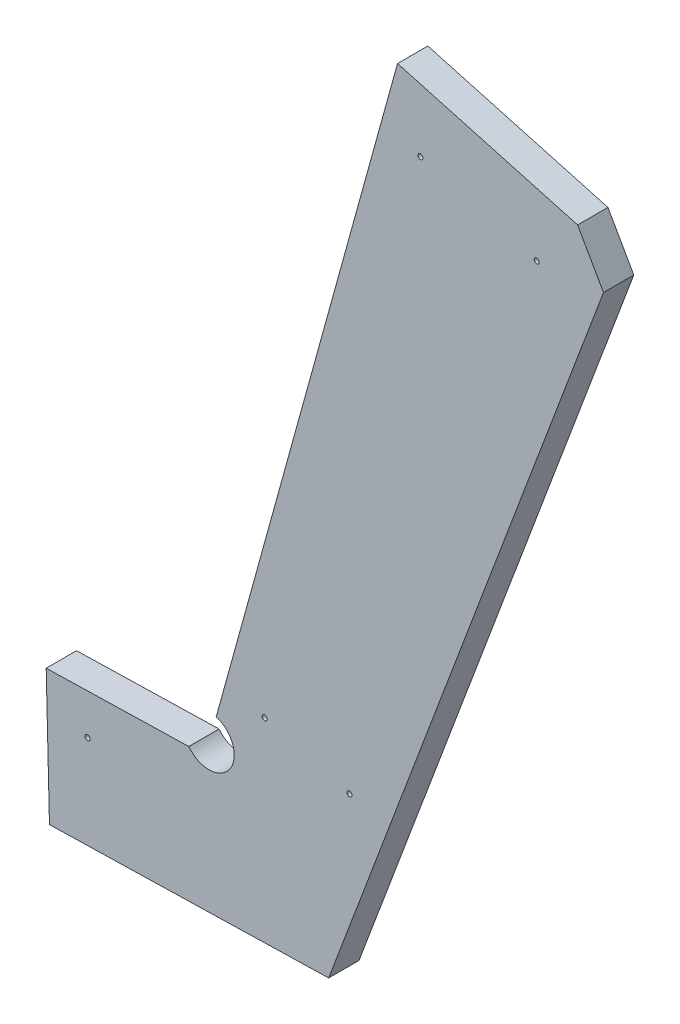
ISO-10303-21;
HEADER;
FILE_DESCRIPTION(('STEP AP214'),'2;1');
FILE_NAME('part.step','',(''),(''),'','','');
FILE_SCHEMA(('AUTOMOTIVE_DESIGN { 1 0 10303 214 1 1 1 1 }'));
ENDSEC;
DATA;
#1=APPLICATION_CONTEXT('core data for automotive mechanical design processes');
#2=APPLICATION_PROTOCOL_DEFINITION('international standard','automotive_design',2000,#1);
#3=PRODUCT_CONTEXT('',#1,'mechanical');
#4=PRODUCT('Part','Part','',(#3));
#5=PRODUCT_RELATED_PRODUCT_CATEGORY('part','',(#4));
#6=PRODUCT_DEFINITION_FORMATION('','',#4);
#7=PRODUCT_DEFINITION_CONTEXT('part definition',#1,'design');
#8=PRODUCT_DEFINITION('design','',#6,#7);
#9=PRODUCT_DEFINITION_SHAPE('','',#8);
#10=(LENGTH_UNIT() NAMED_UNIT(*) SI_UNIT(.MILLI.,.METRE.));
#11=(NAMED_UNIT(*) PLANE_ANGLE_UNIT() SI_UNIT($,.RADIAN.));
#12=(NAMED_UNIT(*) SI_UNIT($,.STERADIAN.) SOLID_ANGLE_UNIT());
#13=UNCERTAINTY_MEASURE_WITH_UNIT(LENGTH_MEASURE(1.E-05),#10,'distance_accuracy_value','');
#14=(GEOMETRIC_REPRESENTATION_CONTEXT(3) GLOBAL_UNCERTAINTY_ASSIGNED_CONTEXT((#13)) GLOBAL_UNIT_ASSIGNED_CONTEXT((#10,
#11,#12)) REPRESENTATION_CONTEXT('',''));
#15=CARTESIAN_POINT('',(0.,0.,0.));
#16=DIRECTION('',(0.,0.,1.));
#17=DIRECTION('',(1.,0.,0.));
#18=AXIS2_PLACEMENT_3D('',#15,#16,#17);
#19=CARTESIAN_POINT('',(-43.5918695212045,-546.396382837879,19.05));
#20=DIRECTION('',(-0.0244097649192743,0.999702037297407,0.));
#21=DIRECTION('',(-0.999702037297407,-0.0244097649192743,0.));
#22=AXIS2_PLACEMENT_3D('',#19,#20,#21);
#23=PLANE('',#22);
#24=DIRECTION('',(0.999702037297407,0.0244097649192743,0.));
#25=VECTOR('',#24,1.);
#26=CARTESIAN_POINT('',(-43.5918695212045,-546.396382837879,0.));
#27=LINE('',#26,#25);
#28=CARTESIAN_POINT('',(-43.5918695212045,-546.396382837879,0.));
#29=VERTEX_POINT('',#28);
#30=CARTESIAN_POINT('',(131.845939781154,-542.112710780353,0.));
#31=VERTEX_POINT('',#30);
#32=EDGE_CURVE('E136',#29,#31,#27,.T.);
#33=ORIENTED_EDGE('',*,*,#32,.T.);
#34=DIRECTION('',(0.,0.,-1.));
#35=VECTOR('',#34,1.);
#36=CARTESIAN_POINT('',(131.845939781154,-542.112710780353,19.05));
#37=LINE('',#36,#35);
#38=CARTESIAN_POINT('',(131.845939781154,-542.112710780353,19.05));
#39=VERTEX_POINT('',#38);
#40=EDGE_CURVE('E11',#39,#31,#37,.T.);
#41=ORIENTED_EDGE('',*,*,#40,.F.);
#42=DIRECTION('',(0.999702037297407,0.0244097649192743,0.));
#43=VECTOR('',#42,1.);
#44=CARTESIAN_POINT('',(-43.5918695212045,-546.396382837879,19.05));
#45=LINE('',#44,#43);
#46=CARTESIAN_POINT('',(-43.5918695212045,-546.396382837879,19.05));
#47=VERTEX_POINT('',#46);
#48=EDGE_CURVE('E151',#47,#39,#45,.T.);
#49=ORIENTED_EDGE('',*,*,#48,.F.);
#50=DIRECTION('',(0.,0.,-1.));
#51=VECTOR('',#50,1.);
#52=CARTESIAN_POINT('',(-43.5918695212045,-546.396382837879,19.05));
#53=LINE('',#52,#51);
#54=EDGE_CURVE('E132',#47,#29,#53,.T.);
#55=ORIENTED_EDGE('',*,*,#54,.T.);
#56=EDGE_LOOP('',(#33,#41,#49,#55));
#57=FACE_BOUND('',#56,.T.);
#58=ADVANCED_FACE('F35',(#57),#23,.F.);
#59=CARTESIAN_POINT('',(131.845939781154,-542.112710780353,19.05));
#60=DIRECTION('',(-0.936051647242176,0.351862634695996,0.));
#61=DIRECTION('',(-0.351862634695997,-0.936051647242176,0.));
#62=AXIS2_PLACEMENT_3D('',#59,#60,#61);
#63=PLANE('',#62);
#64=DIRECTION('',(0.351862634695997,0.936051647242176,0.));
#65=VECTOR('',#64,1.);
#66=CARTESIAN_POINT('',(131.845939781154,-542.112710780353,0.));
#67=LINE('',#66,#65);
#68=CARTESIAN_POINT('',(304.502022378634,-82.7999148610456,0.));
#69=VERTEX_POINT('',#68);
#70=EDGE_CURVE('E139',#31,#69,#67,.T.);
#71=ORIENTED_EDGE('',*,*,#70,.T.);
#72=DIRECTION('',(0.,0.,-1.));
#73=VECTOR('',#72,1.);
#74=CARTESIAN_POINT('',(304.502022378634,-82.7999148610456,19.05));
#75=LINE('',#74,#73);
#76=CARTESIAN_POINT('',(304.502022378634,-82.7999148610456,19.05));
#77=VERTEX_POINT('',#76);
#78=EDGE_CURVE('E44',#77,#69,#75,.T.);
#79=ORIENTED_EDGE('',*,*,#78,.F.);
#80=DIRECTION('',(0.351862634695997,0.936051647242176,0.));
#81=VECTOR('',#80,1.);
#82=CARTESIAN_POINT('',(131.845939781154,-542.112710780353,19.05));
#83=LINE('',#82,#81);
#84=EDGE_CURVE('E97',#39,#77,#83,.T.);
#85=ORIENTED_EDGE('',*,*,#84,.F.);
#86=ORIENTED_EDGE('',*,*,#40,.T.);
#87=EDGE_LOOP('',(#71,#79,#85,#86));
#88=FACE_BOUND('',#87,.T.);
#89=ADVANCED_FACE('F234',(#88),#63,.F.);
#90=CARTESIAN_POINT('',(304.502022378634,-82.7999148610456,19.05));
#91=DIRECTION('',(-0.86983955406196,-0.493334724288987,0.));
#92=DIRECTION('',(0.493334724288987,-0.86983955406196,0.));
#93=AXIS2_PLACEMENT_3D('',#90,#91,#92);
#94=PLANE('',#93);
#95=DIRECTION('',(-0.493334724288987,0.86983955406196,0.));
#96=VECTOR('',#95,1.);
#97=CARTESIAN_POINT('',(304.502022378634,-82.7999148610456,0.));
#98=LINE('',#97,#96);
#99=CARTESIAN_POINT('',(288.249001777841,-54.1428601363266,0.));
#100=VERTEX_POINT('',#99);
#101=EDGE_CURVE('E142',#69,#100,#98,.T.);
#102=ORIENTED_EDGE('',*,*,#101,.T.);
#103=DIRECTION('',(0.,0.,-1.));
#104=VECTOR('',#103,1.);
#105=CARTESIAN_POINT('',(288.249001777841,-54.1428601363266,19.05));
#106=LINE('',#105,#104);
#107=CARTESIAN_POINT('',(288.249001777841,-54.1428601363266,19.05));
#108=VERTEX_POINT('',#107);
#109=EDGE_CURVE('E158',#108,#100,#106,.T.);
#110=ORIENTED_EDGE('',*,*,#109,.F.);
#111=DIRECTION('',(-0.493334724288987,0.86983955406196,0.));
#112=VECTOR('',#111,1.);
#113=CARTESIAN_POINT('',(304.502022378634,-82.7999148610456,19.05));
#114=LINE('',#113,#112);
#115=EDGE_CURVE('E202',#77,#108,#114,.T.);
#116=ORIENTED_EDGE('',*,*,#115,.F.);
#117=ORIENTED_EDGE('',*,*,#78,.T.);
#118=EDGE_LOOP('',(#102,#110,#116,#117));
#119=FACE_BOUND('',#118,.T.);
#120=ADVANCED_FACE('F238',(#119),#94,.F.);
#121=CARTESIAN_POINT('',(288.249001777841,-54.1428601363266,19.05));
#122=DIRECTION('',(-0.266229118281957,-0.963909776161032,0.));
#123=DIRECTION('',(0.963909776161032,-0.266229118281957,0.));
#124=AXIS2_PLACEMENT_3D('',#121,#122,#123);
#125=PLANE('',#124);
#126=DIRECTION('',(-0.963909776161032,0.266229118281957,0.));
#127=VECTOR('',#126,1.);
#128=CARTESIAN_POINT('',(288.249001777841,-54.1428601363266,0.));
#129=LINE('',#128,#127);
#130=CARTESIAN_POINT('',(175.093421906187,-22.8896132008155,0.));
#131=VERTEX_POINT('',#130);
#132=EDGE_CURVE('E144',#100,#131,#129,.T.);
#133=ORIENTED_EDGE('',*,*,#132,.T.);
#134=DIRECTION('',(0.,0.,-1.));
#135=VECTOR('',#134,1.);
#136=CARTESIAN_POINT('',(175.093421906187,-22.8896132008155,19.05));
#137=LINE('',#136,#135);
#138=CARTESIAN_POINT('',(175.093421906187,-22.8896132008155,19.05));
#139=VERTEX_POINT('',#138);
#140=EDGE_CURVE('E155',#139,#131,#137,.T.);
#141=ORIENTED_EDGE('',*,*,#140,.F.);
#142=DIRECTION('',(-0.963909776161032,0.266229118281957,0.));
#143=VECTOR('',#142,1.);
#144=CARTESIAN_POINT('',(288.249001777841,-54.1428601363266,19.05));
#145=LINE('',#144,#143);
#146=EDGE_CURVE('E204',#108,#139,#145,.T.);
#147=ORIENTED_EDGE('',*,*,#146,.F.);
#148=ORIENTED_EDGE('',*,*,#109,.T.);
#149=EDGE_LOOP('',(#133,#141,#147,#148));
#150=FACE_BOUND('',#149,.T.);
#151=ADVANCED_FACE('F210',(#150),#125,.F.);
#152=CARTESIAN_POINT('',(175.093421906187,-22.8896132008155,19.05));
#153=DIRECTION('',(0.963909776161032,-0.266229118281957,0.));
#154=DIRECTION('',(0.266229118281957,0.963909776161032,0.));
#155=AXIS2_PLACEMENT_3D('',#152,#153,#154);
#156=PLANE('',#155);
#157=CARTESIAN_POINT('',(145.805415389934,-128.929838956231,9.52500000000181));
#158=DIRECTION('',(0.963909776161032,-0.266229118281957,0.));
#159=DIRECTION('',(0.266229118281957,0.963909776161032,0.));
#160=AXIS2_PLACEMENT_3D('',#157,#158,#159);
#161=CIRCLE('',#160,1.5875);
#162=CARTESIAN_POINT('',(146.228054115207,-127.399632186576,9.52500000000181));
#163=VERTEX_POINT('',#162);
#164=EDGE_CURVE('E166',#163,#163,#161,.T.);
#165=ORIENTED_EDGE('',*,*,#164,.T.);
#166=EDGE_LOOP('',(#165));
#167=FACE_BOUND('',#166,.T.);
#168=CARTESIAN_POINT('',(87.2294023574429,-341.010290467012,9.52500000000184));
#169=DIRECTION('',(0.963909776161032,-0.266229118281957,0.));
#170=DIRECTION('',(0.266229118281957,0.963909776161032,0.));
#171=AXIS2_PLACEMENT_3D('',#168,#169,#170);
#172=CIRCLE('',#171,1.5875);
#173=CARTESIAN_POINT('',(87.6520410827155,-339.480083697357,9.52500000000184));
#174=VERTEX_POINT('',#173);
#175=EDGE_CURVE('E140',#174,#174,#172,.T.);
#176=ORIENTED_EDGE('',*,*,#175,.T.);
#177=EDGE_LOOP('',(#176));
#178=FACE_BOUND('',#177,.T.);
#179=DIRECTION('',(-0.266229118281957,-0.963909776161032,0.));
#180=VECTOR('',#179,1.);
#181=CARTESIAN_POINT('',(175.093421906187,-22.8896132008155,0.));
#182=LINE('',#181,#180);
#183=CARTESIAN_POINT('',(61.1778172413206,-435.332721236312,0.));
#184=VERTEX_POINT('',#183);
#185=EDGE_CURVE('E146',#131,#184,#182,.T.);
#186=ORIENTED_EDGE('',*,*,#185,.T.);
#187=DIRECTION('',(0.,0.,-1.));
#188=VECTOR('',#187,1.);
#189=CARTESIAN_POINT('',(61.1778172413206,-435.332721236312,19.05));
#190=LINE('',#189,#188);
#191=CARTESIAN_POINT('',(61.1778172413206,-435.332721236312,19.05));
#192=VERTEX_POINT('',#191);
#193=EDGE_CURVE('E127',#192,#184,#190,.T.);
#194=ORIENTED_EDGE('',*,*,#193,.F.);
#195=DIRECTION('',(-0.266229118281957,-0.963909776161032,0.));
#196=VECTOR('',#195,1.);
#197=CARTESIAN_POINT('',(175.093421906187,-22.8896132008155,19.05));
#198=LINE('',#197,#196);
#199=EDGE_CURVE('E118',#139,#192,#198,.T.);
#200=ORIENTED_EDGE('',*,*,#199,.F.);
#201=ORIENTED_EDGE('',*,*,#140,.T.);
#202=EDGE_LOOP('',(#186,#194,#200,#201));
#203=FACE_BOUND('',#202,.T.);
#204=ADVANCED_FACE('F214',(#167,#178,#203),#156,.F.);
#205=CARTESIAN_POINT('',(56.6289305096287,-450.542035964538,19.05));
#206=DIRECTION('',(0.,0.,-1.));
#207=DIRECTION('',(-1.,0.,0.));
#208=AXIS2_PLACEMENT_3D('',#205,#206,#207);
#209=CYLINDRICAL_SURFACE('',#208,15.875);
#210=CARTESIAN_POINT('',(56.6289305096287,-450.542035964538,0.));
#211=DIRECTION('',(0.,0.,-1.));
#212=DIRECTION('',(1.,0.,0.));
#213=AXIS2_PLACEMENT_3D('',#210,#211,#212);
#214=CIRCLE('',#213,15.875);
#215=CARTESIAN_POINT('',(43.9506406577065,-460.095914309516,0.));
#216=VERTEX_POINT('',#215);
#217=EDGE_CURVE('E126',#184,#216,#214,.T.);
#218=ORIENTED_EDGE('',*,*,#217,.T.);
#219=DIRECTION('',(0.,0.,-1.));
#220=VECTOR('',#219,1.);
#221=CARTESIAN_POINT('',(43.9506406577065,-460.095914309516,19.05));
#222=LINE('',#221,#220);
#223=CARTESIAN_POINT('',(43.9506406577065,-460.095914309516,19.05));
#224=VERTEX_POINT('',#223);
#225=EDGE_CURVE('E123',#224,#216,#222,.T.);
#226=ORIENTED_EDGE('',*,*,#225,.F.);
#227=CARTESIAN_POINT('',(56.6289305096287,-450.542035964538,19.05));
#228=DIRECTION('',(0.,0.,-1.));
#229=DIRECTION('',(1.,0.,0.));
#230=AXIS2_PLACEMENT_3D('',#227,#228,#229);
#231=CIRCLE('',#230,15.875);
#232=EDGE_CURVE('E112',#192,#224,#231,.T.);
#233=ORIENTED_EDGE('',*,*,#232,.F.);
#234=ORIENTED_EDGE('',*,*,#193,.T.);
#235=EDGE_LOOP('',(#218,#226,#233,#234));
#236=FACE_BOUND('',#235,.T.);
#237=ADVANCED_FACE('F124',(#236),#209,.F.);
#238=CARTESIAN_POINT('',(43.9506406577065,-460.095914309516,19.05));
#239=DIRECTION('',(0.0244097649192741,-0.999702037297407,0.));
#240=DIRECTION('',(0.999702037297407,0.0244097649192741,0.));
#241=AXIS2_PLACEMENT_3D('',#238,#239,#240);
#242=PLANE('',#241);
#243=DIRECTION('',(-0.999702037297407,-0.0244097649192741,0.));
#244=VECTOR('',#243,1.);
#245=CARTESIAN_POINT('',(43.9506406577065,-460.095914309516,0.));
#246=LINE('',#245,#244);
#247=CARTESIAN_POINT('',(-45.6456549562082,-462.28359066905,0.));
#248=VERTEX_POINT('',#247);
#249=EDGE_CURVE('E83',#216,#248,#246,.T.);
#250=ORIENTED_EDGE('',*,*,#249,.T.);
#251=DIRECTION('',(0.,0.,-1.));
#252=VECTOR('',#251,1.);
#253=CARTESIAN_POINT('',(-45.6456549562082,-462.28359066905,19.05));
#254=LINE('',#253,#252);
#255=CARTESIAN_POINT('',(-45.6456549562082,-462.28359066905,19.05));
#256=VERTEX_POINT('',#255);
#257=EDGE_CURVE('E128',#256,#248,#254,.T.);
#258=ORIENTED_EDGE('',*,*,#257,.F.);
#259=DIRECTION('',(-0.999702037297407,-0.0244097649192741,0.));
#260=VECTOR('',#259,1.);
#261=CARTESIAN_POINT('',(43.9506406577065,-460.095914309516,19.05));
#262=LINE('',#261,#260);
#263=EDGE_CURVE('E116',#224,#256,#262,.T.);
#264=ORIENTED_EDGE('',*,*,#263,.F.);
#265=ORIENTED_EDGE('',*,*,#225,.T.);
#266=EDGE_LOOP('',(#250,#258,#264,#265));
#267=FACE_BOUND('',#266,.T.);
#268=ADVANCED_FACE('F130',(#267),#242,.F.);
#269=CARTESIAN_POINT('',(-45.6456549562082,-462.28359066905,19.05));
#270=DIRECTION('',(0.999702037297407,0.0244097649192742,0.));
#271=DIRECTION('',(-0.0244097649192742,0.999702037297407,0.));
#272=AXIS2_PLACEMENT_3D('',#269,#270,#271);
#273=PLANE('',#272);
#274=DIRECTION('',(0.0244097649192742,-0.999702037297407,0.));
#275=VECTOR('',#274,1.);
#276=CARTESIAN_POINT('',(-45.6456549562082,-462.28359066905,0.));
#277=LINE('',#276,#275);
#278=EDGE_CURVE('E89',#248,#29,#277,.T.);
#279=ORIENTED_EDGE('',*,*,#278,.T.);
#280=ORIENTED_EDGE('',*,*,#54,.F.);
#281=DIRECTION('',(0.0244097649192742,-0.999702037297407,0.));
#282=VECTOR('',#281,1.);
#283=CARTESIAN_POINT('',(-45.6456549562082,-462.28359066905,19.05));
#284=LINE('',#283,#282);
#285=EDGE_CURVE('E53',#256,#47,#284,.T.);
#286=ORIENTED_EDGE('',*,*,#285,.F.);
#287=ORIENTED_EDGE('',*,*,#257,.T.);
#288=EDGE_LOOP('',(#279,#280,#286,#287));
#289=FACE_BOUND('',#288,.T.);
#290=ADVANCED_FACE('F222',(#289),#273,.F.);
#291=CARTESIAN_POINT('',(56.6289305096287,-450.542035964538,19.05));
#292=DIRECTION('',(0.,0.,1.));
#293=DIRECTION('',(1.,0.,0.));
#294=AXIS2_PLACEMENT_3D('',#291,#292,#293);
#295=PLANE('',#294);
#296=CARTESIAN_POINT('',(189.43340081412,-66.376795276948,19.0500000000001));
#297=DIRECTION('',(0.,0.,-1.));
#298=DIRECTION('',(0.,1.,0.));
#299=AXIS2_PLACEMENT_3D('',#296,#297,#298);
#300=CIRCLE('',#299,1.58749999999999);
#301=CARTESIAN_POINT('',(189.43340081412,-64.789295276948,19.0500000000001));
#302=VERTEX_POINT('',#301);
#303=EDGE_CURVE('E381',#302,#302,#300,.T.);
#304=ORIENTED_EDGE('',*,*,#303,.T.);
#305=EDGE_LOOP('',(#304));
#306=FACE_BOUND('',#305,.T.);
#307=CARTESIAN_POINT('',(262.546804291436,-86.5705078253172,19.0500000000001));
#308=DIRECTION('',(0.,0.,-1.));
#309=DIRECTION('',(0.,1.,0.));
#310=AXIS2_PLACEMENT_3D('',#307,#308,#309);
#311=CIRCLE('',#310,1.58750000000002);
#312=CARTESIAN_POINT('',(262.546804291436,-84.9830078253172,19.0500000000001));
#313=VERTEX_POINT('',#312);
#314=EDGE_CURVE('E190',#313,#313,#311,.T.);
#315=ORIENTED_EDGE('',*,*,#314,.T.);
#316=EDGE_LOOP('',(#315));
#317=FACE_BOUND('',#316,.T.);
#318=CARTESIAN_POINT('',(91.5790119553446,-420.668627327197,19.0500000000032));
#319=DIRECTION('',(0.,0.,-1.));
#320=DIRECTION('',(0.,1.,0.));
#321=AXIS2_PLACEMENT_3D('',#318,#319,#320);
#322=CIRCLE('',#321,1.58750000000001);
#323=CARTESIAN_POINT('',(91.5790119553446,-419.081127327197,19.0500000000032));
#324=VERTEX_POINT('',#323);
#325=EDGE_CURVE('E179',#324,#324,#322,.T.);
#326=ORIENTED_EDGE('',*,*,#325,.T.);
#327=EDGE_LOOP('',(#326));
#328=FACE_BOUND('',#327,.T.);
#329=CARTESIAN_POINT('',(144.932354166887,-435.404667572525,19.0500000000032));
#330=DIRECTION('',(0.,0.,-1.));
#331=DIRECTION('',(0.,1.,0.));
#332=AXIS2_PLACEMENT_3D('',#329,#330,#331);
#333=CIRCLE('',#332,1.58749999999999);
#334=CARTESIAN_POINT('',(144.932354166887,-433.817167572525,19.0500000000032));
#335=VERTEX_POINT('',#334);
#336=EDGE_CURVE('E176',#335,#335,#333,.T.);
#337=ORIENTED_EDGE('',*,*,#336,.T.);
#338=EDGE_LOOP('',(#337));
#339=FACE_BOUND('',#338,.T.);
#340=CARTESIAN_POINT('',(-19.6332151799131,-487.05601438749,19.050000000004));
#341=DIRECTION('',(0.,0.,-1.));
#342=DIRECTION('',(0.,1.,0.));
#343=AXIS2_PLACEMENT_3D('',#340,#341,#342);
#344=CIRCLE('',#343,1.5875);
#345=CARTESIAN_POINT('',(-19.6332151799131,-485.46851438749,19.050000000004));
#346=VERTEX_POINT('',#345);
#347=EDGE_CURVE('E173',#346,#346,#344,.T.);
#348=ORIENTED_EDGE('',*,*,#347,.T.);
#349=EDGE_LOOP('',(#348));
#350=FACE_BOUND('',#349,.T.);
#351=ORIENTED_EDGE('',*,*,#48,.T.);
#352=ORIENTED_EDGE('',*,*,#84,.T.);
#353=ORIENTED_EDGE('',*,*,#115,.T.);
#354=ORIENTED_EDGE('',*,*,#146,.T.);
#355=ORIENTED_EDGE('',*,*,#199,.T.);
#356=ORIENTED_EDGE('',*,*,#232,.T.);
#357=ORIENTED_EDGE('',*,*,#263,.T.);
#358=ORIENTED_EDGE('',*,*,#285,.T.);
#359=EDGE_LOOP('',(#351,#352,#353,#354,#355,#356,#357,#358));
#360=FACE_BOUND('',#359,.T.);
#361=ADVANCED_FACE('F114',(#306,#317,#328,#339,#350,#360),#295,.T.);
#362=CARTESIAN_POINT('',(56.6289305096287,-450.542035964538,0.));
#363=DIRECTION('',(0.,0.,1.));
#364=DIRECTION('',(1.,0.,0.));
#365=AXIS2_PLACEMENT_3D('',#362,#363,#364);
#366=PLANE('',#365);
#367=CARTESIAN_POINT('',(189.43340081412,-66.3767952769482,0.));
#368=DIRECTION('',(0.,0.,1.));
#369=DIRECTION('',(1.,0.,0.));
#370=AXIS2_PLACEMENT_3D('',#367,#368,#369);
#371=CIRCLE('',#370,1.58749999999999);
#372=CARTESIAN_POINT('',(191.02090081412,-66.3767952769482,0.));
#373=VERTEX_POINT('',#372);
#374=EDGE_CURVE('E38',#373,#373,#371,.T.);
#375=ORIENTED_EDGE('',*,*,#374,.T.);
#376=EDGE_LOOP('',(#375));
#377=FACE_BOUND('',#376,.T.);
#378=CARTESIAN_POINT('',(262.546804291436,-86.5705078253173,0.));
#379=DIRECTION('',(0.,0.,1.));
#380=DIRECTION('',(1.,0.,0.));
#381=AXIS2_PLACEMENT_3D('',#378,#379,#380);
#382=CIRCLE('',#381,1.58750000000002);
#383=CARTESIAN_POINT('',(264.134304291436,-86.5705078253173,0.));
#384=VERTEX_POINT('',#383);
#385=EDGE_CURVE('E185',#384,#384,#382,.T.);
#386=ORIENTED_EDGE('',*,*,#385,.T.);
#387=EDGE_LOOP('',(#386));
#388=FACE_BOUND('',#387,.T.);
#389=CARTESIAN_POINT('',(91.5790119553446,-420.668627327197,0.));
#390=DIRECTION('',(0.,0.,1.));
#391=DIRECTION('',(1.,0.,0.));
#392=AXIS2_PLACEMENT_3D('',#389,#390,#391);
#393=CIRCLE('',#392,1.58750000000001);
#394=CARTESIAN_POINT('',(93.1665119553446,-420.668627327197,0.));
#395=VERTEX_POINT('',#394);
#396=EDGE_CURVE('E177',#395,#395,#393,.T.);
#397=ORIENTED_EDGE('',*,*,#396,.T.);
#398=EDGE_LOOP('',(#397));
#399=FACE_BOUND('',#398,.T.);
#400=CARTESIAN_POINT('',(144.932354166887,-435.404667572525,0.));
#401=DIRECTION('',(0.,0.,1.));
#402=DIRECTION('',(1.,0.,0.));
#403=AXIS2_PLACEMENT_3D('',#400,#401,#402);
#404=CIRCLE('',#403,1.58749999999999);
#405=CARTESIAN_POINT('',(146.519854166887,-435.404667572525,0.));
#406=VERTEX_POINT('',#405);
#407=EDGE_CURVE('E174',#406,#406,#404,.T.);
#408=ORIENTED_EDGE('',*,*,#407,.T.);
#409=EDGE_LOOP('',(#408));
#410=FACE_BOUND('',#409,.T.);
#411=CARTESIAN_POINT('',(-19.6332151799131,-487.05601438749,0.));
#412=DIRECTION('',(0.,0.,1.));
#413=DIRECTION('',(1.,0.,0.));
#414=AXIS2_PLACEMENT_3D('',#411,#412,#413);
#415=CIRCLE('',#414,1.5875);
#416=CARTESIAN_POINT('',(-18.0457151799131,-487.05601438749,0.));
#417=VERTEX_POINT('',#416);
#418=EDGE_CURVE('E170',#417,#417,#415,.T.);
#419=ORIENTED_EDGE('',*,*,#418,.T.);
#420=EDGE_LOOP('',(#419));
#421=FACE_BOUND('',#420,.T.);
#422=ORIENTED_EDGE('',*,*,#32,.F.);
#423=ORIENTED_EDGE('',*,*,#278,.F.);
#424=ORIENTED_EDGE('',*,*,#249,.F.);
#425=ORIENTED_EDGE('',*,*,#217,.F.);
#426=ORIENTED_EDGE('',*,*,#185,.F.);
#427=ORIENTED_EDGE('',*,*,#132,.F.);
#428=ORIENTED_EDGE('',*,*,#101,.F.);
#429=ORIENTED_EDGE('',*,*,#70,.F.);
#430=EDGE_LOOP('',(#422,#423,#424,#425,#426,#427,#428,#429));
#431=FACE_BOUND('',#430,.T.);
#432=ADVANCED_FACE('F217',(#377,#388,#399,#410,#421,#431),#366,.F.);
#433=CARTESIAN_POINT('',(74.9877482001973,-337.629180664831,9.52500000000184));
#434=DIRECTION('',(-0.963909776161032,0.266229118281957,0.));
#435=DIRECTION('',(-0.266229118281957,-0.963909776161032,0.));
#436=AXIS2_PLACEMENT_3D('',#433,#434,#435);
#437=CYLINDRICAL_SURFACE('',#436,1.5875);
#438=CARTESIAN_POINT('',(105.59188359331,-346.081955170283,9.52500000000184));
#439=DIRECTION('',(-0.963909776161032,0.266229118281957,0.));
#440=DIRECTION('',(-0.266229118281957,-0.963909776161032,0.));
#441=AXIS2_PLACEMENT_3D('',#438,#439,#440);
#442=CIRCLE('',#441,1.5875);
#443=CARTESIAN_POINT('',(105.169244868037,-347.612161939939,9.52500000000184));
#444=VERTEX_POINT('',#443);
#445=EDGE_CURVE('E165',#444,#444,#442,.T.);
#446=ORIENTED_EDGE('',*,*,#445,.F.);
#447=EDGE_LOOP('',(#446));
#448=FACE_BOUND('',#447,.T.);
#449=ORIENTED_EDGE('',*,*,#175,.F.);
#450=EDGE_LOOP('',(#449));
#451=FACE_BOUND('',#450,.T.);
#452=ADVANCED_FACE('F275',(#448,#451),#437,.F.);
#453=CARTESIAN_POINT('',(105.59188359331,-346.081955170283,9.52500000000184));
#454=DIRECTION('',(-0.963909776161032,0.266229118281957,0.));
#455=DIRECTION('',(-0.266229118281957,-0.963909776161032,0.));
#456=AXIS2_PLACEMENT_3D('',#453,#454,#455);
#457=CONICAL_SURFACE('',#456,1.5875,1.02974425867665);
#458=CARTESIAN_POINT('',(106.511324580166,-346.335902136376,9.52500000000184));
#459=VERTEX_POINT('',#458);
#460=VERTEX_LOOP('',#459);
#461=FACE_BOUND('',#460,.T.);
#462=ORIENTED_EDGE('',*,*,#445,.T.);
#463=EDGE_LOOP('',(#462));
#464=FACE_BOUND('',#463,.T.);
#465=ADVANCED_FACE('F280',(#461,#464),#457,.F.);
#466=CARTESIAN_POINT('',(133.563761232689,-125.54872915405,9.52500000000181));
#467=DIRECTION('',(-0.963909776161032,0.266229118281957,0.));
#468=DIRECTION('',(-0.266229118281957,-0.963909776161032,0.));
#469=AXIS2_PLACEMENT_3D('',#466,#467,#468);
#470=CYLINDRICAL_SURFACE('',#469,1.5875);
#471=CARTESIAN_POINT('',(164.167896625802,-134.001503659502,9.52500000000181));
#472=DIRECTION('',(-0.963909776161032,0.266229118281957,0.));
#473=DIRECTION('',(-0.266229118281957,-0.963909776161032,0.));
#474=AXIS2_PLACEMENT_3D('',#471,#472,#473);
#475=CIRCLE('',#474,1.5875);
#476=CARTESIAN_POINT('',(163.745257900529,-135.531710429158,9.52500000000181));
#477=VERTEX_POINT('',#476);
#478=EDGE_CURVE('E169',#477,#477,#475,.T.);
#479=ORIENTED_EDGE('',*,*,#478,.F.);
#480=EDGE_LOOP('',(#479));
#481=FACE_BOUND('',#480,.T.);
#482=ORIENTED_EDGE('',*,*,#164,.F.);
#483=EDGE_LOOP('',(#482));
#484=FACE_BOUND('',#483,.T.);
#485=ADVANCED_FACE('F292',(#481,#484),#470,.F.);
#486=CARTESIAN_POINT('',(164.167896625802,-134.001503659502,9.52500000000181));
#487=DIRECTION('',(-0.963909776161032,0.266229118281957,0.));
#488=DIRECTION('',(-0.266229118281957,-0.963909776161032,0.));
#489=AXIS2_PLACEMENT_3D('',#486,#487,#488);
#490=CONICAL_SURFACE('',#489,1.5875,1.02974425867665);
#491=CARTESIAN_POINT('',(165.087337612657,-134.255450625595,9.52500000000181));
#492=VERTEX_POINT('',#491);
#493=VERTEX_LOOP('',#492);
#494=FACE_BOUND('',#493,.T.);
#495=ORIENTED_EDGE('',*,*,#478,.T.);
#496=EDGE_LOOP('',(#495));
#497=FACE_BOUND('',#496,.T.);
#498=ADVANCED_FACE('F302',(#494,#497),#490,.F.);
#499=CARTESIAN_POINT('',(-19.6332151799131,-487.05601438749,-19.049999999996));
#500=DIRECTION('',(0.,0.,-1.));
#501=DIRECTION('',(0.,1.,0.));
#502=AXIS2_PLACEMENT_3D('',#499,#500,#501);
#503=CYLINDRICAL_SURFACE('',#502,1.5875);
#504=ORIENTED_EDGE('',*,*,#347,.F.);
#505=EDGE_LOOP('',(#504));
#506=FACE_BOUND('',#505,.T.);
#507=ORIENTED_EDGE('',*,*,#418,.F.);
#508=EDGE_LOOP('',(#507));
#509=FACE_BOUND('',#508,.T.);
#510=ADVANCED_FACE('F312',(#506,#509),#503,.F.);
#511=CARTESIAN_POINT('',(144.932354166887,-435.404667572526,-19.0499999999968));
#512=DIRECTION('',(0.,0.,-1.));
#513=DIRECTION('',(0.,1.,0.));
#514=AXIS2_PLACEMENT_3D('',#511,#512,#513);
#515=CYLINDRICAL_SURFACE('',#514,1.58749999999999);
#516=ORIENTED_EDGE('',*,*,#336,.F.);
#517=EDGE_LOOP('',(#516));
#518=FACE_BOUND('',#517,.T.);
#519=ORIENTED_EDGE('',*,*,#407,.F.);
#520=EDGE_LOOP('',(#519));
#521=FACE_BOUND('',#520,.T.);
#522=ADVANCED_FACE('F334',(#518,#521),#515,.F.);
#523=CARTESIAN_POINT('',(91.5790119553446,-420.668627327197,-19.0499999999968));
#524=DIRECTION('',(0.,0.,-1.));
#525=DIRECTION('',(0.,1.,0.));
#526=AXIS2_PLACEMENT_3D('',#523,#524,#525);
#527=CYLINDRICAL_SURFACE('',#526,1.58750000000001);
#528=ORIENTED_EDGE('',*,*,#325,.F.);
#529=EDGE_LOOP('',(#528));
#530=FACE_BOUND('',#529,.T.);
#531=ORIENTED_EDGE('',*,*,#396,.F.);
#532=EDGE_LOOP('',(#531));
#533=FACE_BOUND('',#532,.T.);
#534=ADVANCED_FACE('F344',(#530,#533),#527,.F.);
#535=CARTESIAN_POINT('',(262.546804291436,-86.5705078253175,-19.0499999999999));
#536=DIRECTION('',(0.,0.,-1.));
#537=DIRECTION('',(0.,1.,0.));
#538=AXIS2_PLACEMENT_3D('',#535,#536,#537);
#539=CYLINDRICAL_SURFACE('',#538,1.58750000000002);
#540=ORIENTED_EDGE('',*,*,#314,.F.);
#541=EDGE_LOOP('',(#540));
#542=FACE_BOUND('',#541,.T.);
#543=ORIENTED_EDGE('',*,*,#385,.F.);
#544=EDGE_LOOP('',(#543));
#545=FACE_BOUND('',#544,.T.);
#546=ADVANCED_FACE('F354',(#542,#545),#539,.F.);
#547=CARTESIAN_POINT('',(189.43340081412,-66.3767952769483,-19.0499999999999));
#548=DIRECTION('',(0.,0.,-1.));
#549=DIRECTION('',(0.,1.,0.));
#550=AXIS2_PLACEMENT_3D('',#547,#548,#549);
#551=CYLINDRICAL_SURFACE('',#550,1.58749999999999);
#552=ORIENTED_EDGE('',*,*,#303,.F.);
#553=EDGE_LOOP('',(#552));
#554=FACE_BOUND('',#553,.T.);
#555=ORIENTED_EDGE('',*,*,#374,.F.);
#556=EDGE_LOOP('',(#555));
#557=FACE_BOUND('',#556,.T.);
#558=ADVANCED_FACE('F364',(#554,#557),#551,.F.);
#559=CLOSED_SHELL('',(#58,#89,#120,#151,#204,#237,#268,#290,#361,#432,#452,#465,#485,#498,#510,
#522,#534,#546,#558));
#560=MANIFOLD_SOLID_BREP('B2',#559);
#561=ADVANCED_BREP_SHAPE_REPRESENTATION('',(#18,#560),#14);
#562=SHAPE_DEFINITION_REPRESENTATION(#9,#561);
ENDSEC;
END-ISO-10303-21;
